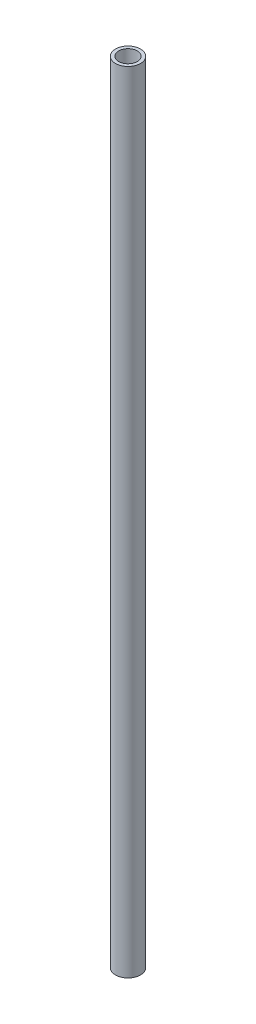
ISO-10303-21;
HEADER;
FILE_DESCRIPTION(('STEP AP214'),'2;1');
FILE_NAME('part.step','',(''),(''),'','','');
FILE_SCHEMA(('AUTOMOTIVE_DESIGN { 1 0 10303 214 1 1 1 1 }'));
ENDSEC;
DATA;
#1=APPLICATION_CONTEXT('core data for automotive mechanical design processes');
#2=APPLICATION_PROTOCOL_DEFINITION('international standard','automotive_design',2000,#1);
#3=PRODUCT_CONTEXT('',#1,'mechanical');
#4=PRODUCT('Part','Part','',(#3));
#5=PRODUCT_RELATED_PRODUCT_CATEGORY('part','',(#4));
#6=PRODUCT_DEFINITION_FORMATION('','',#4);
#7=PRODUCT_DEFINITION_CONTEXT('part definition',#1,'design');
#8=PRODUCT_DEFINITION('design','',#6,#7);
#9=PRODUCT_DEFINITION_SHAPE('','',#8);
#10=(LENGTH_UNIT() NAMED_UNIT(*) SI_UNIT(.MILLI.,.METRE.));
#11=(NAMED_UNIT(*) PLANE_ANGLE_UNIT() SI_UNIT($,.RADIAN.));
#12=(NAMED_UNIT(*) SI_UNIT($,.STERADIAN.) SOLID_ANGLE_UNIT());
#13=UNCERTAINTY_MEASURE_WITH_UNIT(LENGTH_MEASURE(1.E-05),#10,'distance_accuracy_value','');
#14=(GEOMETRIC_REPRESENTATION_CONTEXT(3) GLOBAL_UNCERTAINTY_ASSIGNED_CONTEXT((#13)) GLOBAL_UNIT_ASSIGNED_CONTEXT((#10,
#11,#12)) REPRESENTATION_CONTEXT('',''));
#15=CARTESIAN_POINT('',(0.,0.,0.));
#16=DIRECTION('',(0.,0.,1.));
#17=DIRECTION('',(1.,0.,0.));
#18=AXIS2_PLACEMENT_3D('',#15,#16,#17);
#19=CARTESIAN_POINT('',(0.,400.05,0.));
#20=DIRECTION('',(0.,1.,0.));
#21=DIRECTION('',(0.,0.,1.));
#22=AXIS2_PLACEMENT_3D('',#19,#20,#21);
#23=PLANE('',#22);
#24=CARTESIAN_POINT('',(0.,400.05,0.));
#25=DIRECTION('',(0.,1.,0.));
#26=DIRECTION('',(0.,0.,1.));
#27=AXIS2_PLACEMENT_3D('',#24,#25,#26);
#28=CIRCLE('',#27,6.35);
#29=CARTESIAN_POINT('',(0.,400.05,-6.35));
#30=VERTEX_POINT('',#29);
#31=EDGE_CURVE('E10',#30,#30,#28,.T.);
#32=ORIENTED_EDGE('',*,*,#31,.T.);
#33=EDGE_LOOP('',(#32));
#34=FACE_BOUND('',#33,.T.);
#35=CARTESIAN_POINT('',(0.,400.05,0.));
#36=DIRECTION('',(0.,1.,0.));
#37=DIRECTION('',(0.,0.,1.));
#38=AXIS2_PLACEMENT_3D('',#35,#36,#37);
#39=CIRCLE('',#38,4.699);
#40=CARTESIAN_POINT('',(0.,400.05,-4.699));
#41=VERTEX_POINT('',#40);
#42=EDGE_CURVE('E42',#41,#41,#39,.T.);
#43=ORIENTED_EDGE('',*,*,#42,.F.);
#44=EDGE_LOOP('',(#43));
#45=FACE_BOUND('',#44,.T.);
#46=ADVANCED_FACE('F31',(#34,#45),#23,.T.);
#47=CARTESIAN_POINT('',(0.,0.,0.));
#48=DIRECTION('',(0.,1.,0.));
#49=DIRECTION('',(0.,0.,1.));
#50=AXIS2_PLACEMENT_3D('',#47,#48,#49);
#51=PLANE('',#50);
#52=CARTESIAN_POINT('',(0.,0.,0.));
#53=DIRECTION('',(0.,1.,0.));
#54=DIRECTION('',(0.,0.,1.));
#55=AXIS2_PLACEMENT_3D('',#52,#53,#54);
#56=CIRCLE('',#55,6.35);
#57=CARTESIAN_POINT('',(0.,0.,-6.35));
#58=VERTEX_POINT('',#57);
#59=EDGE_CURVE('E35',#58,#58,#56,.T.);
#60=ORIENTED_EDGE('',*,*,#59,.F.);
#61=EDGE_LOOP('',(#60));
#62=FACE_BOUND('',#61,.T.);
#63=CARTESIAN_POINT('',(0.,0.,0.));
#64=DIRECTION('',(0.,1.,0.));
#65=DIRECTION('',(0.,0.,1.));
#66=AXIS2_PLACEMENT_3D('',#63,#64,#65);
#67=CIRCLE('',#66,4.699);
#68=CARTESIAN_POINT('',(0.,0.,-4.699));
#69=VERTEX_POINT('',#68);
#70=EDGE_CURVE('E44',#69,#69,#67,.T.);
#71=ORIENTED_EDGE('',*,*,#70,.T.);
#72=EDGE_LOOP('',(#71));
#73=FACE_BOUND('',#72,.T.);
#74=ADVANCED_FACE('F54',(#62,#73),#51,.F.);
#75=CARTESIAN_POINT('',(0.,400.05,0.));
#76=DIRECTION('',(0.,-1.,0.));
#77=DIRECTION('',(0.,0.,-1.));
#78=AXIS2_PLACEMENT_3D('',#75,#76,#77);
#79=CYLINDRICAL_SURFACE('',#78,6.35);
#80=CARTESIAN_POINT('',(0.,400.05,-6.35));
#81=CARTESIAN_POINT('',(0.,395.8828125,-6.35));
#82=CARTESIAN_POINT('',(0.,391.715625,-6.35));
#83=CARTESIAN_POINT('',(0.,383.38125,-6.35));
#84=CARTESIAN_POINT('',(0.,379.2140625,-6.35));
#85=CARTESIAN_POINT('',(0.,370.8796875,-6.35));
#86=CARTESIAN_POINT('',(0.,366.7125,-6.35));
#87=CARTESIAN_POINT('',(0.,358.378125,-6.35));
#88=CARTESIAN_POINT('',(0.,354.2109375,-6.35));
#89=CARTESIAN_POINT('',(0.,345.8765625,-6.35));
#90=CARTESIAN_POINT('',(0.,341.709375,-6.35));
#91=CARTESIAN_POINT('',(0.,333.375,-6.35));
#92=CARTESIAN_POINT('',(0.,329.2078125,-6.35));
#93=CARTESIAN_POINT('',(0.,320.8734375,-6.35));
#94=CARTESIAN_POINT('',(0.,316.70625,-6.35));
#95=CARTESIAN_POINT('',(0.,308.371875,-6.35));
#96=CARTESIAN_POINT('',(0.,304.2046875,-6.35));
#97=CARTESIAN_POINT('',(0.,295.8703125,-6.35));
#98=CARTESIAN_POINT('',(0.,291.703125,-6.35));
#99=CARTESIAN_POINT('',(0.,283.36875,-6.35));
#100=CARTESIAN_POINT('',(0.,279.2015625,-6.35));
#101=CARTESIAN_POINT('',(0.,270.8671875,-6.35));
#102=CARTESIAN_POINT('',(0.,266.7,-6.35));
#103=CARTESIAN_POINT('',(0.,258.365625,-6.35));
#104=CARTESIAN_POINT('',(0.,254.1984375,-6.35));
#105=CARTESIAN_POINT('',(0.,245.8640625,-6.35));
#106=CARTESIAN_POINT('',(0.,241.696875,-6.35));
#107=CARTESIAN_POINT('',(0.,233.3625,-6.35));
#108=CARTESIAN_POINT('',(0.,229.1953125,-6.35));
#109=CARTESIAN_POINT('',(0.,220.8609375,-6.35));
#110=CARTESIAN_POINT('',(0.,216.69375,-6.35));
#111=CARTESIAN_POINT('',(0.,208.359375,-6.35));
#112=CARTESIAN_POINT('',(0.,204.1921875,-6.35));
#113=CARTESIAN_POINT('',(0.,195.8578125,-6.35));
#114=CARTESIAN_POINT('',(0.,191.690625,-6.35));
#115=CARTESIAN_POINT('',(0.,183.35625,-6.35));
#116=CARTESIAN_POINT('',(0.,179.1890625,-6.35));
#117=CARTESIAN_POINT('',(0.,170.8546875,-6.35));
#118=CARTESIAN_POINT('',(0.,166.6875,-6.35));
#119=CARTESIAN_POINT('',(0.,158.353125,-6.35));
#120=CARTESIAN_POINT('',(0.,154.1859375,-6.35));
#121=CARTESIAN_POINT('',(0.,145.8515625,-6.35));
#122=CARTESIAN_POINT('',(0.,141.684375,-6.35));
#123=CARTESIAN_POINT('',(0.,133.35,-6.35));
#124=CARTESIAN_POINT('',(0.,129.1828125,-6.35));
#125=CARTESIAN_POINT('',(0.,120.8484375,-6.35));
#126=CARTESIAN_POINT('',(0.,116.68125,-6.35));
#127=CARTESIAN_POINT('',(0.,108.346875,-6.35));
#128=CARTESIAN_POINT('',(0.,104.1796875,-6.35));
#129=CARTESIAN_POINT('',(0.,95.8453125,-6.35));
#130=CARTESIAN_POINT('',(0.,91.678125,-6.35));
#131=CARTESIAN_POINT('',(0.,83.34375,-6.35));
#132=CARTESIAN_POINT('',(0.,79.1765625,-6.35));
#133=CARTESIAN_POINT('',(0.,70.8421875,-6.35));
#134=CARTESIAN_POINT('',(0.,66.675,-6.35));
#135=CARTESIAN_POINT('',(0.,58.340625,-6.35));
#136=CARTESIAN_POINT('',(0.,54.1734375,-6.35));
#137=CARTESIAN_POINT('',(0.,45.8390625,-6.35));
#138=CARTESIAN_POINT('',(0.,41.671875,-6.35));
#139=CARTESIAN_POINT('',(0.,33.3375,-6.35));
#140=CARTESIAN_POINT('',(0.,29.1703125,-6.35));
#141=CARTESIAN_POINT('',(0.,20.8359375,-6.35));
#142=CARTESIAN_POINT('',(0.,16.66875,-6.35));
#143=CARTESIAN_POINT('',(0.,8.334375,-6.35));
#144=CARTESIAN_POINT('',(0.,4.1671875,-6.35));
#145=CARTESIAN_POINT('',(0.,0.,-6.35));
#146=B_SPLINE_CURVE_WITH_KNOTS('',3,(#80,#81,#82,#83,#84,#85,#86,#87,#88,#89,#90,#91,#92,#93,
#94,#95,#96,#97,#98,#99,#100,#101,#102,#103,#104,#105,#106,#107,#108,#109,#110,#111,#112,#113,
#114,#115,#116,#117,#118,#119,#120,#121,#122,#123,#124,#125,#126,#127,#128,#129,#130,#131,#132,
#133,#134,#135,#136,#137,#138,#139,#140,#141,#142,#143,#144,#145),.UNSPECIFIED.,.F.,.F.,(4,2,2,
2,2,2,2,2,2,2,2,2,2,2,2,2,2,2,2,2,2,2,2,2,2,2,2,2,2,2,2,2,4),(0.,12.5015625,25.003125,
37.5046875,50.00625,62.5078125,75.009375,87.5109375,100.0125,112.5140625,125.015625,137.5171875,
150.01875,162.5203125,175.021875,187.5234375,200.025,212.5265625,225.028125,237.5296875,
250.03125,262.5328125,275.034375,287.5359375,300.0375,312.5390625,325.040625,337.5421875,
350.04375,362.5453125,375.046875,387.5484375,400.05),.UNSPECIFIED.);
#147=EDGE_CURVE('BSEAM33',#30,#58,#146,.T.);
#148=ORIENTED_EDGE('',*,*,#31,.F.);
#149=ORIENTED_EDGE('',*,*,#59,.T.);
#150=ORIENTED_EDGE('',*,*,#147,.T.);
#151=ORIENTED_EDGE('',*,*,#147,.F.);
#152=EDGE_LOOP('',(#148,#150,#149,#151));
#153=FACE_BOUND('',#152,.T.);
#154=ADVANCED_FACE('F33',(#153),#79,.T.);
#155=CARTESIAN_POINT('',(0.,400.05,0.));
#156=DIRECTION('',(0.,-1.,0.));
#157=DIRECTION('',(0.,0.,-1.));
#158=AXIS2_PLACEMENT_3D('',#155,#156,#157);
#159=CYLINDRICAL_SURFACE('',#158,4.699);
#160=CARTESIAN_POINT('',(0.,400.05,-4.699));
#161=CARTESIAN_POINT('',(0.,395.8828125,-4.699));
#162=CARTESIAN_POINT('',(0.,391.715625,-4.699));
#163=CARTESIAN_POINT('',(0.,383.38125,-4.699));
#164=CARTESIAN_POINT('',(0.,379.2140625,-4.699));
#165=CARTESIAN_POINT('',(0.,370.8796875,-4.699));
#166=CARTESIAN_POINT('',(0.,366.7125,-4.699));
#167=CARTESIAN_POINT('',(0.,358.378125,-4.699));
#168=CARTESIAN_POINT('',(0.,354.2109375,-4.699));
#169=CARTESIAN_POINT('',(0.,345.8765625,-4.699));
#170=CARTESIAN_POINT('',(0.,341.709375,-4.699));
#171=CARTESIAN_POINT('',(0.,333.375,-4.699));
#172=CARTESIAN_POINT('',(0.,329.2078125,-4.699));
#173=CARTESIAN_POINT('',(0.,320.8734375,-4.699));
#174=CARTESIAN_POINT('',(0.,316.70625,-4.699));
#175=CARTESIAN_POINT('',(0.,308.371875,-4.699));
#176=CARTESIAN_POINT('',(0.,304.2046875,-4.699));
#177=CARTESIAN_POINT('',(0.,295.8703125,-4.699));
#178=CARTESIAN_POINT('',(0.,291.703125,-4.699));
#179=CARTESIAN_POINT('',(0.,283.36875,-4.699));
#180=CARTESIAN_POINT('',(0.,279.2015625,-4.699));
#181=CARTESIAN_POINT('',(0.,270.8671875,-4.699));
#182=CARTESIAN_POINT('',(0.,266.7,-4.699));
#183=CARTESIAN_POINT('',(0.,258.365625,-4.699));
#184=CARTESIAN_POINT('',(0.,254.1984375,-4.699));
#185=CARTESIAN_POINT('',(0.,245.8640625,-4.699));
#186=CARTESIAN_POINT('',(0.,241.696875,-4.699));
#187=CARTESIAN_POINT('',(0.,233.3625,-4.699));
#188=CARTESIAN_POINT('',(0.,229.1953125,-4.699));
#189=CARTESIAN_POINT('',(0.,220.8609375,-4.699));
#190=CARTESIAN_POINT('',(0.,216.69375,-4.699));
#191=CARTESIAN_POINT('',(0.,208.359375,-4.699));
#192=CARTESIAN_POINT('',(0.,204.1921875,-4.699));
#193=CARTESIAN_POINT('',(0.,195.8578125,-4.699));
#194=CARTESIAN_POINT('',(0.,191.690625,-4.699));
#195=CARTESIAN_POINT('',(0.,183.35625,-4.699));
#196=CARTESIAN_POINT('',(0.,179.1890625,-4.699));
#197=CARTESIAN_POINT('',(0.,170.8546875,-4.699));
#198=CARTESIAN_POINT('',(0.,166.6875,-4.699));
#199=CARTESIAN_POINT('',(0.,158.353125,-4.699));
#200=CARTESIAN_POINT('',(0.,154.1859375,-4.699));
#201=CARTESIAN_POINT('',(0.,145.8515625,-4.699));
#202=CARTESIAN_POINT('',(0.,141.684375,-4.699));
#203=CARTESIAN_POINT('',(0.,133.35,-4.699));
#204=CARTESIAN_POINT('',(0.,129.1828125,-4.699));
#205=CARTESIAN_POINT('',(0.,120.8484375,-4.699));
#206=CARTESIAN_POINT('',(0.,116.68125,-4.699));
#207=CARTESIAN_POINT('',(0.,108.346875,-4.699));
#208=CARTESIAN_POINT('',(0.,104.1796875,-4.699));
#209=CARTESIAN_POINT('',(0.,95.8453125,-4.699));
#210=CARTESIAN_POINT('',(0.,91.678125,-4.699));
#211=CARTESIAN_POINT('',(0.,83.34375,-4.699));
#212=CARTESIAN_POINT('',(0.,79.1765625,-4.699));
#213=CARTESIAN_POINT('',(0.,70.8421875,-4.699));
#214=CARTESIAN_POINT('',(0.,66.675,-4.699));
#215=CARTESIAN_POINT('',(0.,58.340625,-4.699));
#216=CARTESIAN_POINT('',(0.,54.1734375,-4.699));
#217=CARTESIAN_POINT('',(0.,45.8390625,-4.699));
#218=CARTESIAN_POINT('',(0.,41.671875,-4.699));
#219=CARTESIAN_POINT('',(0.,33.3375,-4.699));
#220=CARTESIAN_POINT('',(0.,29.1703125,-4.699));
#221=CARTESIAN_POINT('',(0.,20.8359375,-4.699));
#222=CARTESIAN_POINT('',(0.,16.66875,-4.699));
#223=CARTESIAN_POINT('',(0.,8.334375,-4.699));
#224=CARTESIAN_POINT('',(0.,4.1671875,-4.699));
#225=CARTESIAN_POINT('',(0.,0.,-4.699));
#226=B_SPLINE_CURVE_WITH_KNOTS('',3,(#160,#161,#162,#163,#164,#165,#166,#167,#168,#169,#170,
#171,#172,#173,#174,#175,#176,#177,#178,#179,#180,#181,#182,#183,#184,#185,#186,#187,#188,#189,
#190,#191,#192,#193,#194,#195,#196,#197,#198,#199,#200,#201,#202,#203,#204,#205,#206,#207,#208,
#209,#210,#211,#212,#213,#214,#215,#216,#217,#218,#219,#220,#221,#222,#223,#224,#225),
.UNSPECIFIED.,.F.,.F.,(4,2,2,2,2,2,2,2,2,2,2,2,2,2,2,2,2,2,2,2,2,2,2,2,2,2,2,2,2,2,2,2,4),(0.,
12.5015625,25.003125,37.5046875,50.00625,62.5078125,75.009375,87.5109375,100.0125,112.5140625,
125.015625,137.5171875,150.01875,162.5203125,175.021875,187.5234375,200.025,212.5265625,
225.028125,237.5296875,250.03125,262.5328125,275.034375,287.5359375,300.0375,312.5390625,
325.040625,337.5421875,350.04375,362.5453125,375.046875,387.5484375,400.05),.UNSPECIFIED.);
#227=EDGE_CURVE('BSEAM50',#41,#69,#226,.T.);
#228=ORIENTED_EDGE('',*,*,#42,.T.);
#229=ORIENTED_EDGE('',*,*,#70,.F.);
#230=ORIENTED_EDGE('',*,*,#227,.T.);
#231=ORIENTED_EDGE('',*,*,#227,.F.);
#232=EDGE_LOOP('',(#228,#230,#229,#231));
#233=FACE_BOUND('',#232,.T.);
#234=ADVANCED_FACE('F50',(#233),#159,.F.);
#235=CLOSED_SHELL('',(#46,#74,#154,#234));
#236=MANIFOLD_SOLID_BREP('B2',#235);
#237=ADVANCED_BREP_SHAPE_REPRESENTATION('',(#18,#236),#14);
#238=SHAPE_DEFINITION_REPRESENTATION(#9,#237);
ENDSEC;
END-ISO-10303-21;
